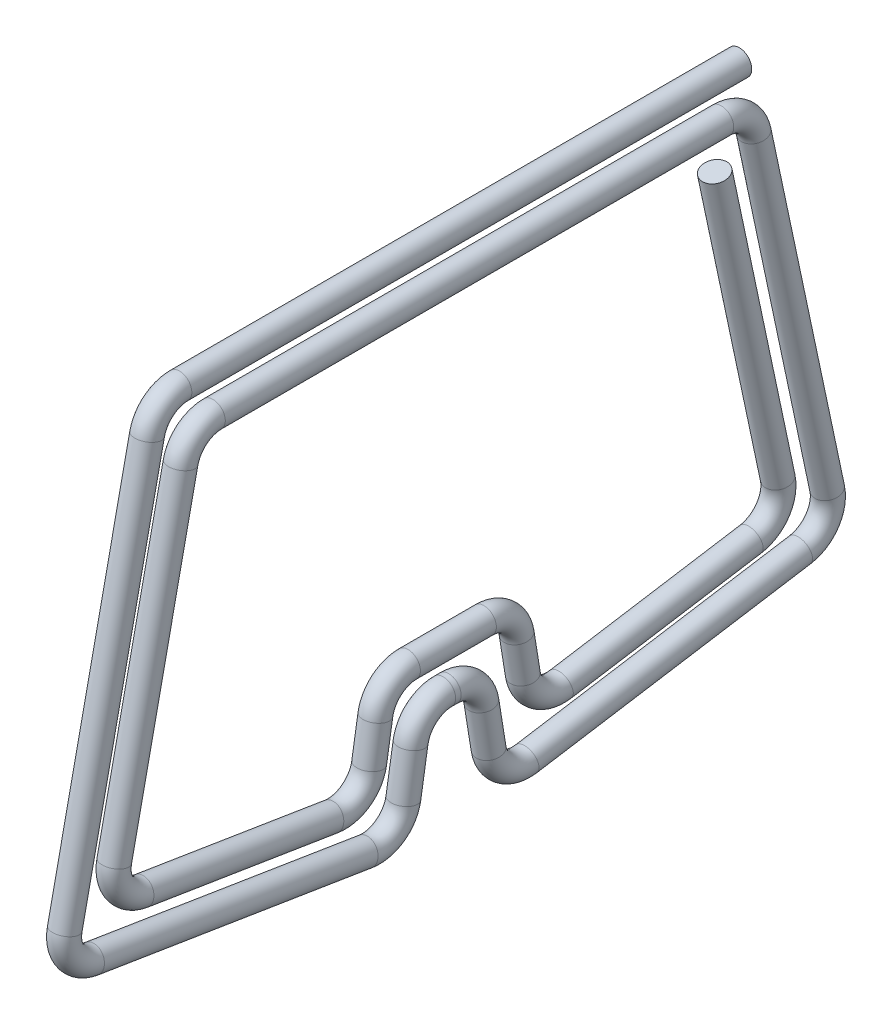
ISO-10303-21;
HEADER;
FILE_DESCRIPTION(('STEP AP214'),'2;1');
FILE_NAME('part.step','',(''),(''),'','','');
FILE_SCHEMA(('AUTOMOTIVE_DESIGN { 1 0 10303 214 1 1 1 1 }'));
ENDSEC;
DATA;
#1=APPLICATION_CONTEXT('core data for automotive mechanical design processes');
#2=APPLICATION_PROTOCOL_DEFINITION('international standard','automotive_design',2000,#1);
#3=PRODUCT_CONTEXT('',#1,'mechanical');
#4=PRODUCT('Part','Part','',(#3));
#5=PRODUCT_RELATED_PRODUCT_CATEGORY('part','',(#4));
#6=PRODUCT_DEFINITION_FORMATION('','',#4);
#7=PRODUCT_DEFINITION_CONTEXT('part definition',#1,'design');
#8=PRODUCT_DEFINITION('design','',#6,#7);
#9=PRODUCT_DEFINITION_SHAPE('','',#8);
#10=(LENGTH_UNIT() NAMED_UNIT(*) SI_UNIT(.MILLI.,.METRE.));
#11=(NAMED_UNIT(*) PLANE_ANGLE_UNIT() SI_UNIT($,.RADIAN.));
#12=(NAMED_UNIT(*) SI_UNIT($,.STERADIAN.) SOLID_ANGLE_UNIT());
#13=UNCERTAINTY_MEASURE_WITH_UNIT(LENGTH_MEASURE(1.E-05),#10,'distance_accuracy_value','');
#14=(GEOMETRIC_REPRESENTATION_CONTEXT(3) GLOBAL_UNCERTAINTY_ASSIGNED_CONTEXT((#13)) GLOBAL_UNIT_ASSIGNED_CONTEXT((#10,
#11,#12)) REPRESENTATION_CONTEXT('',''));
#15=CARTESIAN_POINT('',(0.,0.,0.));
#16=DIRECTION('',(0.,0.,1.));
#17=DIRECTION('',(1.,0.,0.));
#18=AXIS2_PLACEMENT_3D('',#15,#16,#17);
#19=CARTESIAN_POINT('',(0.,-40.8872377564679,-40.1258053985485));
#20=DIRECTION('',(0.,0.978147600733806,0.207911690817757));
#21=DIRECTION('',(0.,-0.207911690817757,0.978147600733806));
#22=AXIS2_PLACEMENT_3D('',#19,#20,#21);
#23=CYLINDRICAL_SURFACE('',#22,1.5);
#24=CARTESIAN_POINT('',(0.,-40.8872377564679,-40.1258053985485));
#25=DIRECTION('',(0.,-0.978147600733785,-0.207911690817856));
#26=DIRECTION('',(-1.,0.,0.));
#27=AXIS2_PLACEMENT_3D('',#24,#25,#26);
#28=CIRCLE('',#27,1.5);
#29=CARTESIAN_POINT('',(0.,-40.5753702202413,-41.5930267996492));
#30=VERTEX_POINT('',#29);
#31=EDGE_CURVE('E39',#30,#30,#28,.T.);
#32=ORIENTED_EDGE('',*,*,#31,.F.);
#33=EDGE_LOOP('',(#32));
#34=FACE_BOUND('',#33,.T.);
#35=CARTESIAN_POINT('',(0.,-5.00000000000002,-32.4977375331992));
#36=DIRECTION('',(0.,-0.978147600733785,-0.207911690817856));
#37=DIRECTION('',(-1.,0.,0.));
#38=AXIS2_PLACEMENT_3D('',#35,#36,#37);
#39=CIRCLE('',#38,1.5);
#40=CARTESIAN_POINT('',(-1.5,-5.00000000000002,-32.4977375331992));
#41=VERTEX_POINT('',#40);
#42=EDGE_CURVE('E10',#41,#41,#39,.T.);
#43=ORIENTED_EDGE('',*,*,#42,.T.);
#44=EDGE_LOOP('',(#43));
#45=FACE_BOUND('',#44,.T.);
#46=ADVANCED_FACE('F33',(#34,#45),#23,.T.);
#47=CARTESIAN_POINT('',(0.,-41.7188845197389,-36.2132149956133));
#48=DIRECTION('',(1.,0.,0.));
#49=DIRECTION('',(0.,0.,-1.));
#50=AXIS2_PLACEMENT_3D('',#47,#48,#49);
#51=TOROIDAL_SURFACE('',#50,3.99999999999996,1.5);
#52=CARTESIAN_POINT('',(0.,-45.6680705058202,-36.8487699085352));
#53=DIRECTION('',(0.,-0.158888728230554,0.987296496520309));
#54=DIRECTION('',(-1.,0.,0.));
#55=AXIS2_PLACEMENT_3D('',#52,#53,#54);
#56=CIRCLE('',#55,1.5);
#57=CARTESIAN_POINT('',(0.,-47.1490152506007,-37.0871030008808));
#58=VERTEX_POINT('',#57);
#59=EDGE_CURVE('E43',#58,#58,#56,.T.);
#60=CARTESIAN_POINT('',(0.,-41.7188845197389,-36.2132149956133));
#61=DIRECTION('',(1.,0.,0.));
#62=DIRECTION('',(0.,0.,-1.));
#63=AXIS2_PLACEMENT_3D('',#60,#61,#62);
#64=CIRCLE('',#63,5.49999999999996);
#65=EDGE_CURVE('',#58,#30,#64,.T.);
#66=ORIENTED_EDGE('',*,*,#59,.F.);
#67=ORIENTED_EDGE('',*,*,#31,.T.);
#68=ORIENTED_EDGE('',*,*,#65,.T.);
#69=ORIENTED_EDGE('',*,*,#65,.F.);
#70=EDGE_LOOP('',(#66,#68,#67,#69));
#71=FACE_BOUND('',#70,.T.);
#72=ADVANCED_FACE('F305',(#71),#51,.T.);
#73=CARTESIAN_POINT('',(0.,-49.3644450870781,-13.8803837017478));
#74=DIRECTION('',(0.,0.158888728230469,-0.987296496520323));
#75=DIRECTION('',(0.,0.987296496520323,0.158888728230469));
#76=AXIS2_PLACEMENT_3D('',#73,#74,#75);
#77=CYLINDRICAL_SURFACE('',#76,1.5);
#78=CARTESIAN_POINT('',(0.,-49.3644450870781,-13.8803837017478));
#79=DIRECTION('',(0.,-0.158888728230554,0.987296496520309));
#80=DIRECTION('',(-1.,0.,0.));
#81=AXIS2_PLACEMENT_3D('',#78,#79,#80);
#82=CIRCLE('',#81,1.5);
#83=CARTESIAN_POINT('',(0.,-50.8453898318586,-14.1187167940935));
#84=VERTEX_POINT('',#83);
#85=EDGE_CURVE('E47',#84,#84,#82,.T.);
#86=ORIENTED_EDGE('',*,*,#85,.F.);
#87=EDGE_LOOP('',(#86));
#88=FACE_BOUND('',#87,.T.);
#89=ORIENTED_EDGE('',*,*,#59,.T.);
#90=EDGE_LOOP('',(#89));
#91=FACE_BOUND('',#90,.T.);
#92=ADVANCED_FACE('F299',(#88,#91),#77,.T.);
#93=CARTESIAN_POINT('',(0.,-45.4152591009968,-13.244828788826));
#94=DIRECTION('',(1.,0.,0.));
#95=DIRECTION('',(0.,0.,-1.));
#96=AXIS2_PLACEMENT_3D('',#93,#94,#95);
#97=TOROIDAL_SURFACE('',#96,3.99999999999996,1.5);
#98=CARTESIAN_POINT('',(0.,-46.0508140139187,-9.29564280274469));
#99=DIRECTION('',(0.,0.987296496520311,0.158888728230541));
#100=DIRECTION('',(-1.,0.,0.));
#101=AXIS2_PLACEMENT_3D('',#98,#99,#100);
#102=CIRCLE('',#101,1.5);
#103=CARTESIAN_POINT('',(0.,-46.2891471062643,-7.8146980579642));
#104=VERTEX_POINT('',#103);
#105=EDGE_CURVE('E52',#104,#104,#102,.T.);
#106=CARTESIAN_POINT('',(0.,-45.4152591009968,-13.244828788826));
#107=DIRECTION('',(1.,0.,0.));
#108=DIRECTION('',(0.,0.,-1.));
#109=AXIS2_PLACEMENT_3D('',#106,#107,#108);
#110=CIRCLE('',#109,5.49999999999996);
#111=EDGE_CURVE('',#104,#84,#110,.T.);
#112=ORIENTED_EDGE('',*,*,#105,.F.);
#113=ORIENTED_EDGE('',*,*,#85,.T.);
#114=ORIENTED_EDGE('',*,*,#111,.T.);
#115=ORIENTED_EDGE('',*,*,#111,.F.);
#116=EDGE_LOOP('',(#112,#114,#113,#115));
#117=FACE_BOUND('',#116,.T.);
#118=ADVANCED_FACE('F293',(#117),#97,.T.);
#119=CARTESIAN_POINT('',(0.,-41.3644450870781,-8.54145072222094));
#120=DIRECTION('',(0.,-0.987296496520323,-0.158888728230468));
#121=DIRECTION('',(0.,0.158888728230468,-0.987296496520323));
#122=AXIS2_PLACEMENT_3D('',#119,#120,#121);
#123=CYLINDRICAL_SURFACE('',#122,1.5);
#124=CARTESIAN_POINT('',(0.,-41.3644450870781,-8.54145072222094));
#125=DIRECTION('',(0.,0.987296496520311,0.158888728230541));
#126=DIRECTION('',(-1.,0.,0.));
#127=AXIS2_PLACEMENT_3D('',#124,#125,#126);
#128=CIRCLE('',#127,1.5);
#129=CARTESIAN_POINT('',(0.,-41.1261119947324,-10.0223954670014));
#130=VERTEX_POINT('',#129);
#131=EDGE_CURVE('E55',#130,#130,#128,.T.);
#132=ORIENTED_EDGE('',*,*,#131,.F.);
#133=EDGE_LOOP('',(#132));
#134=FACE_BOUND('',#133,.T.);
#135=ORIENTED_EDGE('',*,*,#105,.T.);
#136=EDGE_LOOP('',(#135));
#137=FACE_BOUND('',#136,.T.);
#138=ADVANCED_FACE('F287',(#134,#137),#123,.T.);
#139=CARTESIAN_POINT('',(0.,-42.,-4.59226473613961));
#140=DIRECTION('',(-1.,0.,0.));
#141=DIRECTION('',(0.,0.,1.));
#142=AXIS2_PLACEMENT_3D('',#139,#140,#141);
#143=TOROIDAL_SURFACE('',#142,4.00000000000004,1.5);
#144=CARTESIAN_POINT('',(0.,-38.,-4.59226473613957));
#145=DIRECTION('',(0.,0.,1.));
#146=DIRECTION('',(-1.,0.,0.));
#147=AXIS2_PLACEMENT_3D('',#144,#145,#146);
#148=CIRCLE('',#147,1.5);
#149=CARTESIAN_POINT('',(0.,-36.5,-4.59226473613955));
#150=VERTEX_POINT('',#149);
#151=EDGE_CURVE('E58',#150,#150,#148,.T.);
#152=CARTESIAN_POINT('',(0.,-42.,-4.59226473613961));
#153=DIRECTION('',(-1.,0.,0.));
#154=DIRECTION('',(0.,0.,1.));
#155=AXIS2_PLACEMENT_3D('',#152,#153,#154);
#156=CIRCLE('',#155,5.50000000000004);
#157=EDGE_CURVE('',#150,#130,#156,.T.);
#158=ORIENTED_EDGE('',*,*,#151,.F.);
#159=ORIENTED_EDGE('',*,*,#131,.T.);
#160=ORIENTED_EDGE('',*,*,#157,.T.);
#161=ORIENTED_EDGE('',*,*,#157,.F.);
#162=EDGE_LOOP('',(#158,#160,#159,#161));
#163=FACE_BOUND('',#162,.T.);
#164=ADVANCED_FACE('F281',(#163),#143,.T.);
#165=CARTESIAN_POINT('',(0.,-38.,4.59226473613959));
#166=DIRECTION('',(0.,0.,-1.));
#167=DIRECTION('',(-1.,0.,0.));
#168=AXIS2_PLACEMENT_3D('',#165,#166,#167);
#169=CYLINDRICAL_SURFACE('',#168,1.5);
#170=CARTESIAN_POINT('',(0.,-38.,4.59226473613959));
#171=DIRECTION('',(0.,0.,1.));
#172=DIRECTION('',(-1.,0.,0.));
#173=AXIS2_PLACEMENT_3D('',#170,#171,#172);
#174=CIRCLE('',#173,1.5);
#175=CARTESIAN_POINT('',(0.,-36.5,4.59226473613959));
#176=VERTEX_POINT('',#175);
#177=EDGE_CURVE('E61',#176,#176,#174,.T.);
#178=ORIENTED_EDGE('',*,*,#177,.F.);
#179=EDGE_LOOP('',(#178));
#180=FACE_BOUND('',#179,.T.);
#181=ORIENTED_EDGE('',*,*,#151,.T.);
#182=EDGE_LOOP('',(#181));
#183=FACE_BOUND('',#182,.T.);
#184=ADVANCED_FACE('F275',(#180,#183),#169,.T.);
#185=CARTESIAN_POINT('',(0.,-42.,4.5922647361396));
#186=DIRECTION('',(-1.,0.,0.));
#187=DIRECTION('',(0.,0.,1.));
#188=AXIS2_PLACEMENT_3D('',#185,#186,#187);
#189=TOROIDAL_SURFACE('',#188,4.00000000000004,1.5);
#190=CARTESIAN_POINT('',(0.,-41.3644450870782,8.54145072222093));
#191=DIRECTION('',(0.,-0.987296496520339,0.15888872823037));
#192=DIRECTION('',(-1.,0.,0.));
#193=AXIS2_PLACEMENT_3D('',#190,#191,#192);
#194=CIRCLE('',#193,1.5);
#195=CARTESIAN_POINT('',(0.,-41.1261119947325,10.0223954670014));
#196=VERTEX_POINT('',#195);
#197=EDGE_CURVE('E64',#196,#196,#194,.T.);
#198=CARTESIAN_POINT('',(0.,-42.,4.5922647361396));
#199=DIRECTION('',(-1.,0.,0.));
#200=DIRECTION('',(0.,0.,1.));
#201=AXIS2_PLACEMENT_3D('',#198,#199,#200);
#202=CIRCLE('',#201,5.50000000000004);
#203=EDGE_CURVE('',#196,#176,#202,.T.);
#204=ORIENTED_EDGE('',*,*,#197,.F.);
#205=ORIENTED_EDGE('',*,*,#177,.T.);
#206=ORIENTED_EDGE('',*,*,#203,.T.);
#207=ORIENTED_EDGE('',*,*,#203,.F.);
#208=EDGE_LOOP('',(#204,#206,#205,#207));
#209=FACE_BOUND('',#208,.T.);
#210=ADVANCED_FACE('F269',(#209),#189,.T.);
#211=CARTESIAN_POINT('',(0.,-46.0508140139187,9.29564280274468));
#212=DIRECTION('',(0.,0.987296496520323,-0.158888728230467));
#213=DIRECTION('',(0.,0.158888728230467,0.987296496520323));
#214=AXIS2_PLACEMENT_3D('',#211,#212,#213);
#215=CYLINDRICAL_SURFACE('',#214,1.5);
#216=CARTESIAN_POINT('',(0.,-46.0508140139187,9.29564280274468));
#217=DIRECTION('',(0.,-0.987296496520339,0.15888872823037));
#218=DIRECTION('',(-1.,0.,0.));
#219=AXIS2_PLACEMENT_3D('',#216,#217,#218);
#220=CIRCLE('',#219,1.5);
#221=CARTESIAN_POINT('',(0.,-46.2891471062644,7.81469805796419));
#222=VERTEX_POINT('',#221);
#223=EDGE_CURVE('E67',#222,#222,#220,.T.);
#224=ORIENTED_EDGE('',*,*,#223,.F.);
#225=EDGE_LOOP('',(#224));
#226=FACE_BOUND('',#225,.T.);
#227=ORIENTED_EDGE('',*,*,#197,.T.);
#228=EDGE_LOOP('',(#227));
#229=FACE_BOUND('',#228,.T.);
#230=ADVANCED_FACE('F263',(#226,#229),#215,.T.);
#231=CARTESIAN_POINT('',(0.,-45.4152591009968,13.2448287888259));
#232=DIRECTION('',(1.,0.,0.));
#233=DIRECTION('',(0.,0.,-1.));
#234=AXIS2_PLACEMENT_3D('',#231,#232,#233);
#235=TOROIDAL_SURFACE('',#234,3.99999999999997,1.5);
#236=CARTESIAN_POINT('',(0.,-49.3644450870781,13.8803837017479));
#237=DIRECTION('',(0.,0.158888728230384,0.987296496520336));
#238=DIRECTION('',(-1.,0.,0.));
#239=AXIS2_PLACEMENT_3D('',#236,#237,#238);
#240=CIRCLE('',#239,1.5);
#241=CARTESIAN_POINT('',(0.,-50.8453898318586,14.1187167940936));
#242=VERTEX_POINT('',#241);
#243=EDGE_CURVE('E70',#242,#242,#240,.T.);
#244=CARTESIAN_POINT('',(0.,-45.4152591009968,13.2448287888259));
#245=DIRECTION('',(1.,0.,0.));
#246=DIRECTION('',(0.,0.,-1.));
#247=AXIS2_PLACEMENT_3D('',#244,#245,#246);
#248=CIRCLE('',#247,5.49999999999997);
#249=EDGE_CURVE('',#242,#222,#248,.T.);
#250=ORIENTED_EDGE('',*,*,#243,.F.);
#251=ORIENTED_EDGE('',*,*,#223,.T.);
#252=ORIENTED_EDGE('',*,*,#249,.T.);
#253=ORIENTED_EDGE('',*,*,#249,.F.);
#254=EDGE_LOOP('',(#250,#252,#251,#253));
#255=FACE_BOUND('',#254,.T.);
#256=ADVANCED_FACE('F257',(#255),#235,.T.);
#257=CARTESIAN_POINT('',(0.,-45.6680705058202,36.8487699085352));
#258=DIRECTION('',(0.,-0.158888728230468,-0.987296496520323));
#259=DIRECTION('',(0.,0.987296496520323,-0.158888728230468));
#260=AXIS2_PLACEMENT_3D('',#257,#258,#259);
#261=CYLINDRICAL_SURFACE('',#260,1.5);
#262=CARTESIAN_POINT('',(0.,-45.6680705058202,36.8487699085352));
#263=DIRECTION('',(0.,0.158888728230384,0.987296496520336));
#264=DIRECTION('',(-1.,0.,0.));
#265=AXIS2_PLACEMENT_3D('',#262,#263,#264);
#266=CIRCLE('',#265,1.5);
#267=CARTESIAN_POINT('',(0.,-47.1490152506007,37.0871030008809));
#268=VERTEX_POINT('',#267);
#269=EDGE_CURVE('E73',#268,#268,#266,.T.);
#270=ORIENTED_EDGE('',*,*,#269,.F.);
#271=EDGE_LOOP('',(#270));
#272=FACE_BOUND('',#271,.T.);
#273=ORIENTED_EDGE('',*,*,#243,.T.);
#274=EDGE_LOOP('',(#273));
#275=FACE_BOUND('',#274,.T.);
#276=ADVANCED_FACE('F251',(#272,#275),#261,.T.);
#277=CARTESIAN_POINT('',(0.,-41.718884519739,36.2132149956133));
#278=DIRECTION('',(1.,0.,0.));
#279=DIRECTION('',(0.,0.,-1.));
#280=AXIS2_PLACEMENT_3D('',#277,#278,#279);
#281=TOROIDAL_SURFACE('',#280,3.99999999999997,1.5);
#282=CARTESIAN_POINT('',(0.,-40.8872377564679,40.1258053985485));
#283=DIRECTION('',(0.,0.978147600733821,-0.207911690817688));
#284=DIRECTION('',(-1.,0.,0.));
#285=AXIS2_PLACEMENT_3D('',#282,#283,#284);
#286=CIRCLE('',#285,1.5);
#287=CARTESIAN_POINT('',(0.,-40.5753702202412,41.5930267996492));
#288=VERTEX_POINT('',#287);
#289=EDGE_CURVE('E76',#288,#288,#286,.T.);
#290=CARTESIAN_POINT('',(0.,-41.718884519739,36.2132149956133));
#291=DIRECTION('',(1.,0.,0.));
#292=DIRECTION('',(0.,0.,-1.));
#293=AXIS2_PLACEMENT_3D('',#290,#291,#292);
#294=CIRCLE('',#293,5.49999999999997);
#295=EDGE_CURVE('',#288,#268,#294,.T.);
#296=ORIENTED_EDGE('',*,*,#289,.F.);
#297=ORIENTED_EDGE('',*,*,#269,.T.);
#298=ORIENTED_EDGE('',*,*,#295,.T.);
#299=ORIENTED_EDGE('',*,*,#295,.F.);
#300=EDGE_LOOP('',(#296,#298,#297,#299));
#301=FACE_BOUND('',#300,.T.);
#302=ADVANCED_FACE('F245',(#301),#281,.T.);
#303=CARTESIAN_POINT('',(0.,-3.16835323672899,32.1084089950043));
#304=DIRECTION('',(0.,-0.978147600733806,0.207911690817756));
#305=DIRECTION('',(0.,-0.207911690817756,-0.978147600733806));
#306=AXIS2_PLACEMENT_3D('',#303,#304,#305);
#307=CYLINDRICAL_SURFACE('',#306,1.5);
#308=CARTESIAN_POINT('',(0.,-3.16835323672899,32.1084089950043));
#309=DIRECTION('',(0.,0.978147600733821,-0.207911690817688));
#310=DIRECTION('',(-1.,0.,0.));
#311=AXIS2_PLACEMENT_3D('',#308,#309,#310);
#312=CIRCLE('',#311,1.5);
#313=CARTESIAN_POINT('',(0.,-2.85648570050236,33.575630396105));
#314=VERTEX_POINT('',#313);
#315=EDGE_CURVE('E79',#314,#314,#312,.T.);
#316=ORIENTED_EDGE('',*,*,#315,.F.);
#317=EDGE_LOOP('',(#316));
#318=FACE_BOUND('',#317,.T.);
#319=ORIENTED_EDGE('',*,*,#289,.T.);
#320=EDGE_LOOP('',(#319));
#321=FACE_BOUND('',#320,.T.);
#322=ADVANCED_FACE('F239',(#318,#321),#307,.T.);
#323=CARTESIAN_POINT('',(0.,-4.00000000000001,28.1958185920691));
#324=DIRECTION('',(1.,0.,0.));
#325=DIRECTION('',(0.,0.,-1.));
#326=AXIS2_PLACEMENT_3D('',#323,#324,#325);
#327=TOROIDAL_SURFACE('',#326,3.99999999999998,1.5);
#328=CARTESIAN_POINT('',(0.,0.,28.1958185920691));
#329=DIRECTION('',(0.,0.,-1.));
#330=DIRECTION('',(-1.,0.,0.));
#331=AXIS2_PLACEMENT_3D('',#328,#329,#330);
#332=CIRCLE('',#331,1.5);
#333=CARTESIAN_POINT('',(0.,1.49999999999997,28.1958185920691));
#334=VERTEX_POINT('',#333);
#335=EDGE_CURVE('E82',#334,#334,#332,.T.);
#336=CARTESIAN_POINT('',(0.,-4.00000000000001,28.1958185920691));
#337=DIRECTION('',(1.,0.,0.));
#338=DIRECTION('',(0.,0.,-1.));
#339=AXIS2_PLACEMENT_3D('',#336,#337,#338);
#340=CIRCLE('',#339,5.49999999999998);
#341=EDGE_CURVE('',#334,#314,#340,.T.);
#342=ORIENTED_EDGE('',*,*,#335,.F.);
#343=ORIENTED_EDGE('',*,*,#315,.T.);
#344=ORIENTED_EDGE('',*,*,#341,.T.);
#345=ORIENTED_EDGE('',*,*,#341,.F.);
#346=EDGE_LOOP('',(#342,#344,#343,#345));
#347=FACE_BOUND('',#346,.T.);
#348=ADVANCED_FACE('F233',(#347),#327,.T.);
#349=CARTESIAN_POINT('',(0.,0.,-33.3075215663943));
#350=DIRECTION('',(0.,0.,1.));
#351=DIRECTION('',(0.,-1.,0.));
#352=AXIS2_PLACEMENT_3D('',#349,#350,#351);
#353=CYLINDRICAL_SURFACE('',#352,1.5);
#354=CARTESIAN_POINT('',(0.,0.,-33.3075215663943));
#355=DIRECTION('',(0.,0.,-1.));
#356=DIRECTION('',(-1.,0.,0.));
#357=AXIS2_PLACEMENT_3D('',#354,#355,#356);
#358=CIRCLE('',#357,1.5);
#359=CARTESIAN_POINT('',(0.,1.49999999999998,-33.3075215663943));
#360=VERTEX_POINT('',#359);
#361=EDGE_CURVE('E85',#360,#360,#358,.T.);
#362=ORIENTED_EDGE('',*,*,#361,.F.);
#363=EDGE_LOOP('',(#362));
#364=FACE_BOUND('',#363,.T.);
#365=ORIENTED_EDGE('',*,*,#335,.T.);
#366=EDGE_LOOP('',(#365));
#367=FACE_BOUND('',#366,.T.);
#368=ADVANCED_FACE('F227',(#364,#367),#353,.T.);
#369=CARTESIAN_POINT('',(0.,-4.,-33.3075215663943));
#370=DIRECTION('',(1.,0.,0.));
#371=DIRECTION('',(0.,0.,-1.));
#372=AXIS2_PLACEMENT_3D('',#369,#370,#371);
#373=TOROIDAL_SURFACE('',#372,3.99999999999998,1.5);
#374=CARTESIAN_POINT('',(0.,-3.16835323672902,-37.2201119693295));
#375=DIRECTION('',(0.,-0.978147600733796,-0.207911690817803));
#376=DIRECTION('',(-1.,0.,0.));
#377=AXIS2_PLACEMENT_3D('',#374,#375,#376);
#378=CIRCLE('',#377,1.5);
#379=CARTESIAN_POINT('',(0.,-2.8564857005024,-38.6873333704302));
#380=VERTEX_POINT('',#379);
#381=EDGE_CURVE('E88',#380,#380,#378,.T.);
#382=CARTESIAN_POINT('',(0.,-4.,-33.3075215663943));
#383=DIRECTION('',(1.,0.,0.));
#384=DIRECTION('',(0.,0.,-1.));
#385=AXIS2_PLACEMENT_3D('',#382,#383,#384);
#386=CIRCLE('',#385,5.49999999999998);
#387=EDGE_CURVE('',#380,#360,#386,.T.);
#388=ORIENTED_EDGE('',*,*,#381,.F.);
#389=ORIENTED_EDGE('',*,*,#361,.T.);
#390=ORIENTED_EDGE('',*,*,#387,.T.);
#391=ORIENTED_EDGE('',*,*,#387,.F.);
#392=EDGE_LOOP('',(#388,#390,#389,#391));
#393=FACE_BOUND('',#392,.T.);
#394=ADVANCED_FACE('F221',(#393),#373,.T.);
#395=CARTESIAN_POINT('',(0.,-44.9886321067942,-46.1092866540319));
#396=DIRECTION('',(0.,0.978147600733806,0.207911690817756));
#397=DIRECTION('',(0.,-0.207911690817757,0.978147600733806));
#398=AXIS2_PLACEMENT_3D('',#395,#396,#397);
#399=CYLINDRICAL_SURFACE('',#398,1.5);
#400=CARTESIAN_POINT('',(0.,-44.9886321067942,-46.1092866540319));
#401=DIRECTION('',(0.,-0.978147600733796,-0.207911690817803));
#402=DIRECTION('',(-1.,0.,0.));
#403=AXIS2_PLACEMENT_3D('',#400,#401,#402);
#404=CIRCLE('',#403,1.5);
#405=CARTESIAN_POINT('',(0.,-44.6767645705676,-47.5765080551326));
#406=VERTEX_POINT('',#405);
#407=EDGE_CURVE('E91',#406,#406,#404,.T.);
#408=ORIENTED_EDGE('',*,*,#407,.F.);
#409=EDGE_LOOP('',(#408));
#410=FACE_BOUND('',#409,.T.);
#411=ORIENTED_EDGE('',*,*,#381,.T.);
#412=EDGE_LOOP('',(#411));
#413=FACE_BOUND('',#412,.T.);
#414=ADVANCED_FACE('F215',(#410,#413),#399,.T.);
#415=CARTESIAN_POINT('',(0.,-45.8202788700653,-42.1966962510967));
#416=DIRECTION('',(1.,0.,0.));
#417=DIRECTION('',(0.,0.,-1.));
#418=AXIS2_PLACEMENT_3D('',#415,#416,#417);
#419=TOROIDAL_SURFACE('',#418,3.99999999999998,1.5);
#420=CARTESIAN_POINT('',(0.,-49.7694648561465,-42.8322511640185));
#421=DIRECTION('',(0.,-0.158888728230501,0.987296496520318));
#422=DIRECTION('',(-1.,0.,0.));
#423=AXIS2_PLACEMENT_3D('',#420,#421,#422);
#424=CIRCLE('',#423,1.5);
#425=CARTESIAN_POINT('',(0.,-51.250409600927,-43.0705842563642));
#426=VERTEX_POINT('',#425);
#427=EDGE_CURVE('E94',#426,#426,#424,.T.);
#428=CARTESIAN_POINT('',(0.,-45.8202788700653,-42.1966962510967));
#429=DIRECTION('',(1.,0.,0.));
#430=DIRECTION('',(0.,0.,-1.));
#431=AXIS2_PLACEMENT_3D('',#428,#429,#430);
#432=CIRCLE('',#431,5.49999999999998);
#433=EDGE_CURVE('',#426,#406,#432,.T.);
#434=ORIENTED_EDGE('',*,*,#427,.F.);
#435=ORIENTED_EDGE('',*,*,#407,.T.);
#436=ORIENTED_EDGE('',*,*,#433,.T.);
#437=ORIENTED_EDGE('',*,*,#433,.F.);
#438=EDGE_LOOP('',(#434,#436,#435,#437));
#439=FACE_BOUND('',#438,.T.);
#440=ADVANCED_FACE('F209',(#439),#419,.T.);
#441=CARTESIAN_POINT('',(0.,-55.0953712108321,-9.73834486029859));
#442=DIRECTION('',(0.,0.158888728230468,-0.987296496520323));
#443=DIRECTION('',(0.,0.987296496520323,0.158888728230468));
#444=AXIS2_PLACEMENT_3D('',#441,#442,#443);
#445=CYLINDRICAL_SURFACE('',#444,1.5);
#446=CARTESIAN_POINT('',(0.,-55.0953712108321,-9.73834486029859));
#447=DIRECTION('',(0.,-0.158888728230501,0.987296496520318));
#448=DIRECTION('',(-1.,0.,0.));
#449=AXIS2_PLACEMENT_3D('',#446,#447,#448);
#450=CIRCLE('',#449,1.5);
#451=CARTESIAN_POINT('',(0.,-56.5763159556125,-9.97667795264429));
#452=VERTEX_POINT('',#451);
#453=EDGE_CURVE('E97',#452,#452,#450,.T.);
#454=ORIENTED_EDGE('',*,*,#453,.F.);
#455=EDGE_LOOP('',(#454));
#456=FACE_BOUND('',#455,.T.);
#457=ORIENTED_EDGE('',*,*,#427,.T.);
#458=EDGE_LOOP('',(#457));
#459=FACE_BOUND('',#458,.T.);
#460=ADVANCED_FACE('F203',(#456,#459),#445,.T.);
#461=CARTESIAN_POINT('',(0.,-51.1461852247508,-9.10278994737669));
#462=DIRECTION('',(1.,0.,0.));
#463=DIRECTION('',(0.,0.,-1.));
#464=AXIS2_PLACEMENT_3D('',#461,#462,#463);
#465=TOROIDAL_SURFACE('',#464,3.99999999999998,1.5);
#466=CARTESIAN_POINT('',(0.,-51.7817401376726,-5.15360396129542));
#467=DIRECTION('',(0.,0.98729649652032,0.158888728230487));
#468=DIRECTION('',(-1.,0.,0.));
#469=AXIS2_PLACEMENT_3D('',#466,#467,#468);
#470=CIRCLE('',#469,1.5);
#471=CARTESIAN_POINT('',(0.,-52.0200732300183,-3.67265921651493));
#472=VERTEX_POINT('',#471);
#473=EDGE_CURVE('E100',#472,#472,#470,.T.);
#474=CARTESIAN_POINT('',(0.,-51.1461852247508,-9.10278994737669));
#475=DIRECTION('',(1.,0.,0.));
#476=DIRECTION('',(0.,0.,-1.));
#477=AXIS2_PLACEMENT_3D('',#474,#475,#476);
#478=CIRCLE('',#477,5.49999999999998);
#479=EDGE_CURVE('',#472,#452,#478,.T.);
#480=ORIENTED_EDGE('',*,*,#473,.F.);
#481=ORIENTED_EDGE('',*,*,#453,.T.);
#482=ORIENTED_EDGE('',*,*,#479,.T.);
#483=ORIENTED_EDGE('',*,*,#479,.F.);
#484=EDGE_LOOP('',(#480,#482,#481,#483));
#485=FACE_BOUND('',#484,.T.);
#486=ADVANCED_FACE('F197',(#485),#465,.T.);
#487=CARTESIAN_POINT('',(0.,-46.3644450870781,-4.28178164239544));
#488=DIRECTION('',(0.,-0.987296496520323,-0.158888728230468));
#489=DIRECTION('',(0.,0.158888728230468,-0.987296496520323));
#490=AXIS2_PLACEMENT_3D('',#487,#488,#489);
#491=CYLINDRICAL_SURFACE('',#490,1.5);
#492=CARTESIAN_POINT('',(0.,-46.3644450870781,-4.28178164239544));
#493=DIRECTION('',(0.,0.98729649652032,0.158888728230487));
#494=DIRECTION('',(-1.,0.,0.));
#495=AXIS2_PLACEMENT_3D('',#492,#493,#494);
#496=CIRCLE('',#495,1.5);
#497=CARTESIAN_POINT('',(0.,-46.1261119947324,-5.76272638717592));
#498=VERTEX_POINT('',#497);
#499=EDGE_CURVE('E103',#498,#498,#496,.T.);
#500=ORIENTED_EDGE('',*,*,#499,.F.);
#501=EDGE_LOOP('',(#500));
#502=FACE_BOUND('',#501,.T.);
#503=ORIENTED_EDGE('',*,*,#473,.T.);
#504=EDGE_LOOP('',(#503));
#505=FACE_BOUND('',#504,.T.);
#506=ADVANCED_FACE('F191',(#502,#505),#491,.T.);
#507=CARTESIAN_POINT('',(0.,-47.,-0.332595656314122));
#508=DIRECTION('',(-1.,0.,0.));
#509=DIRECTION('',(0.,0.,1.));
#510=AXIS2_PLACEMENT_3D('',#507,#508,#509);
#511=TOROIDAL_SURFACE('',#510,4.00000000000002,1.5);
#512=CARTESIAN_POINT('',(0.,-43.,-0.332595656314101));
#513=DIRECTION('',(0.,0.,1.));
#514=DIRECTION('',(-1.,0.,0.));
#515=AXIS2_PLACEMENT_3D('',#512,#513,#514);
#516=CIRCLE('',#515,1.5);
#517=CARTESIAN_POINT('',(0.,-41.5,-0.332595656314093));
#518=VERTEX_POINT('',#517);
#519=EDGE_CURVE('E106',#518,#518,#516,.T.);
#520=CARTESIAN_POINT('',(0.,-47.,-0.332595656314122));
#521=DIRECTION('',(-1.,0.,0.));
#522=DIRECTION('',(0.,0.,1.));
#523=AXIS2_PLACEMENT_3D('',#520,#521,#522);
#524=CIRCLE('',#523,5.50000000000002);
#525=EDGE_CURVE('',#518,#498,#524,.T.);
#526=ORIENTED_EDGE('',*,*,#519,.F.);
#527=ORIENTED_EDGE('',*,*,#499,.T.);
#528=ORIENTED_EDGE('',*,*,#525,.T.);
#529=ORIENTED_EDGE('',*,*,#525,.F.);
#530=EDGE_LOOP('',(#526,#528,#527,#529));
#531=FACE_BOUND('',#530,.T.);
#532=ADVANCED_FACE('F185',(#531),#511,.T.);
#533=CARTESIAN_POINT('',(0.,-43.,0.332595656314071));
#534=DIRECTION('',(0.,0.,-1.));
#535=DIRECTION('',(-1.,0.,0.));
#536=AXIS2_PLACEMENT_3D('',#533,#534,#535);
#537=CYLINDRICAL_SURFACE('',#536,1.5);
#538=CARTESIAN_POINT('',(0.,-43.,0.332595656314071));
#539=DIRECTION('',(0.,0.,1.));
#540=DIRECTION('',(-1.,0.,0.));
#541=AXIS2_PLACEMENT_3D('',#538,#539,#540);
#542=CIRCLE('',#541,1.5);
#543=CARTESIAN_POINT('',(0.,-41.5,0.33259565631406));
#544=VERTEX_POINT('',#543);
#545=EDGE_CURVE('E109',#544,#544,#542,.T.);
#546=ORIENTED_EDGE('',*,*,#545,.F.);
#547=EDGE_LOOP('',(#546));
#548=FACE_BOUND('',#547,.T.);
#549=ORIENTED_EDGE('',*,*,#519,.T.);
#550=EDGE_LOOP('',(#549));
#551=FACE_BOUND('',#550,.T.);
#552=ADVANCED_FACE('F179',(#548,#551),#537,.T.);
#553=CARTESIAN_POINT('',(0.,-47.,0.332595656314098));
#554=DIRECTION('',(-1.,0.,0.));
#555=DIRECTION('',(0.,0.,1.));
#556=AXIS2_PLACEMENT_3D('',#553,#554,#555);
#557=TOROIDAL_SURFACE('',#556,4.00000000000001,1.5);
#558=CARTESIAN_POINT('',(0.,-46.3644450870781,4.28178164239541));
#559=DIRECTION('',(0.,-0.98729649652033,0.158888728230428));
#560=DIRECTION('',(-1.,0.,0.));
#561=AXIS2_PLACEMENT_3D('',#558,#559,#560);
#562=CIRCLE('',#561,1.5);
#563=CARTESIAN_POINT('',(0.,-46.1261119947325,5.76272638717589));
#564=VERTEX_POINT('',#563);
#565=EDGE_CURVE('E112',#564,#564,#562,.T.);
#566=CARTESIAN_POINT('',(0.,-47.,0.332595656314098));
#567=DIRECTION('',(-1.,0.,0.));
#568=DIRECTION('',(0.,0.,1.));
#569=AXIS2_PLACEMENT_3D('',#566,#567,#568);
#570=CIRCLE('',#569,5.50000000000001);
#571=EDGE_CURVE('',#564,#544,#570,.T.);
#572=ORIENTED_EDGE('',*,*,#565,.F.);
#573=ORIENTED_EDGE('',*,*,#545,.T.);
#574=ORIENTED_EDGE('',*,*,#571,.T.);
#575=ORIENTED_EDGE('',*,*,#571,.F.);
#576=EDGE_LOOP('',(#572,#574,#573,#575));
#577=FACE_BOUND('',#576,.T.);
#578=ADVANCED_FACE('F173',(#577),#557,.T.);
#579=CARTESIAN_POINT('',(0.,-51.7817401376726,5.15360396129538));
#580=DIRECTION('',(0.,0.987296496520323,-0.158888728230469));
#581=DIRECTION('',(0.,0.158888728230469,0.987296496520323));
#582=AXIS2_PLACEMENT_3D('',#579,#580,#581);
#583=CYLINDRICAL_SURFACE('',#582,1.5);
#584=CARTESIAN_POINT('',(0.,-51.7817401376726,5.15360396129538));
#585=DIRECTION('',(0.,-0.98729649652033,0.158888728230428));
#586=DIRECTION('',(-1.,0.,0.));
#587=AXIS2_PLACEMENT_3D('',#584,#585,#586);
#588=CIRCLE('',#587,1.5);
#589=CARTESIAN_POINT('',(0.,-52.0200732300183,3.67265921651489));
#590=VERTEX_POINT('',#589);
#591=EDGE_CURVE('E115',#590,#590,#588,.T.);
#592=ORIENTED_EDGE('',*,*,#591,.F.);
#593=EDGE_LOOP('',(#592));
#594=FACE_BOUND('',#593,.T.);
#595=ORIENTED_EDGE('',*,*,#565,.T.);
#596=EDGE_LOOP('',(#595));
#597=FACE_BOUND('',#596,.T.);
#598=ADVANCED_FACE('F167',(#594,#597),#583,.T.);
#599=CARTESIAN_POINT('',(0.,-51.1461852247508,9.10278994737667));
#600=DIRECTION('',(1.,0.,0.));
#601=DIRECTION('',(0.,0.,-1.));
#602=AXIS2_PLACEMENT_3D('',#599,#600,#601);
#603=TOROIDAL_SURFACE('',#602,3.99999999999999,1.5);
#604=CARTESIAN_POINT('',(0.,-55.0953712108321,9.73834486029857));
#605=DIRECTION('',(0.,0.158888728230442,0.987296496520327));
#606=DIRECTION('',(-1.,0.,0.));
#607=AXIS2_PLACEMENT_3D('',#604,#605,#606);
#608=CIRCLE('',#607,1.5);
#609=CARTESIAN_POINT('',(0.,-56.5763159556126,9.97667795264429));
#610=VERTEX_POINT('',#609);
#611=EDGE_CURVE('E118',#610,#610,#608,.T.);
#612=CARTESIAN_POINT('',(0.,-51.1461852247508,9.10278994737667));
#613=DIRECTION('',(1.,0.,0.));
#614=DIRECTION('',(0.,0.,-1.));
#615=AXIS2_PLACEMENT_3D('',#612,#613,#614);
#616=CIRCLE('',#615,5.49999999999999);
#617=EDGE_CURVE('',#610,#590,#616,.T.);
#618=ORIENTED_EDGE('',*,*,#611,.F.);
#619=ORIENTED_EDGE('',*,*,#591,.T.);
#620=ORIENTED_EDGE('',*,*,#617,.T.);
#621=ORIENTED_EDGE('',*,*,#617,.F.);
#622=EDGE_LOOP('',(#618,#620,#619,#621));
#623=FACE_BOUND('',#622,.T.);
#624=ADVANCED_FACE('F161',(#623),#603,.T.);
#625=CARTESIAN_POINT('',(0.,-49.7694648561466,42.8322511640185));
#626=DIRECTION('',(0.,-0.158888728230468,-0.987296496520323));
#627=DIRECTION('',(0.,0.987296496520323,-0.158888728230468));
#628=AXIS2_PLACEMENT_3D('',#625,#626,#627);
#629=CYLINDRICAL_SURFACE('',#628,1.5);
#630=CARTESIAN_POINT('',(0.,-49.7694648561466,42.8322511640185));
#631=DIRECTION('',(0.,0.158888728230442,0.987296496520327));
#632=DIRECTION('',(-1.,0.,0.));
#633=AXIS2_PLACEMENT_3D('',#630,#631,#632);
#634=CIRCLE('',#633,1.5);
#635=CARTESIAN_POINT('',(0.,-51.250409600927,43.0705842563642));
#636=VERTEX_POINT('',#635);
#637=EDGE_CURVE('E121',#636,#636,#634,.T.);
#638=ORIENTED_EDGE('',*,*,#637,.F.);
#639=EDGE_LOOP('',(#638));
#640=FACE_BOUND('',#639,.T.);
#641=ORIENTED_EDGE('',*,*,#611,.T.);
#642=EDGE_LOOP('',(#641));
#643=FACE_BOUND('',#642,.T.);
#644=ADVANCED_FACE('F155',(#640,#643),#629,.T.);
#645=CARTESIAN_POINT('',(0.,-45.8202788700653,42.1966962510967));
#646=DIRECTION('',(1.,0.,0.));
#647=DIRECTION('',(0.,0.,-1.));
#648=AXIS2_PLACEMENT_3D('',#645,#646,#647);
#649=TOROIDAL_SURFACE('',#648,3.99999999999999,1.5);
#650=CARTESIAN_POINT('',(0.,-44.9886321067942,46.1092866540319));
#651=DIRECTION('',(0.,0.978147600733809,-0.207911690817745));
#652=DIRECTION('',(-1.,0.,0.));
#653=AXIS2_PLACEMENT_3D('',#650,#651,#652);
#654=CIRCLE('',#653,1.5);
#655=CARTESIAN_POINT('',(0.,-44.6767645705676,47.5765080551326));
#656=VERTEX_POINT('',#655);
#657=EDGE_CURVE('E124',#656,#656,#654,.T.);
#658=CARTESIAN_POINT('',(0.,-45.8202788700653,42.1966962510967));
#659=DIRECTION('',(1.,0.,0.));
#660=DIRECTION('',(0.,0.,-1.));
#661=AXIS2_PLACEMENT_3D('',#658,#659,#660);
#662=CIRCLE('',#661,5.5);
#663=EDGE_CURVE('',#656,#636,#662,.T.);
#664=ORIENTED_EDGE('',*,*,#657,.F.);
#665=ORIENTED_EDGE('',*,*,#637,.T.);
#666=ORIENTED_EDGE('',*,*,#663,.T.);
#667=ORIENTED_EDGE('',*,*,#663,.F.);
#668=EDGE_LOOP('',(#664,#666,#665,#667));
#669=FACE_BOUND('',#668,.T.);
#670=ADVANCED_FACE('F149',(#669),#649,.T.);
#671=CARTESIAN_POINT('',(0.,1.831646763271,36.1573291609794));
#672=DIRECTION('',(0.,-0.978147600733806,0.207911690817756));
#673=DIRECTION('',(0.,-0.207911690817756,-0.978147600733806));
#674=AXIS2_PLACEMENT_3D('',#671,#672,#673);
#675=CYLINDRICAL_SURFACE('',#674,1.5);
#676=CARTESIAN_POINT('',(0.,1.831646763271,36.1573291609794));
#677=DIRECTION('',(0.,0.978147600733809,-0.207911690817745));
#678=DIRECTION('',(-1.,0.,0.));
#679=AXIS2_PLACEMENT_3D('',#676,#677,#678);
#680=CIRCLE('',#679,1.5);
#681=CARTESIAN_POINT('',(0.,2.14351429949763,37.6245505620801));
#682=VERTEX_POINT('',#681);
#683=EDGE_CURVE('E127',#682,#682,#680,.T.);
#684=ORIENTED_EDGE('',*,*,#683,.F.);
#685=EDGE_LOOP('',(#684));
#686=FACE_BOUND('',#685,.T.);
#687=ORIENTED_EDGE('',*,*,#657,.T.);
#688=EDGE_LOOP('',(#687));
#689=FACE_BOUND('',#688,.T.);
#690=ADVANCED_FACE('F143',(#686,#689),#675,.T.);
#691=CARTESIAN_POINT('',(0.,1.,32.2447387580442));
#692=DIRECTION('',(1.,0.,0.));
#693=DIRECTION('',(0.,0.,-1.));
#694=AXIS2_PLACEMENT_3D('',#691,#692,#693);
#695=TOROIDAL_SURFACE('',#694,4.,1.5);
#696=CARTESIAN_POINT('',(0.,5.,32.2447387580441));
#697=DIRECTION('',(0.,0.,-1.));
#698=DIRECTION('',(-1.,0.,0.));
#699=AXIS2_PLACEMENT_3D('',#696,#697,#698);
#700=CIRCLE('',#699,1.5);
#701=CARTESIAN_POINT('',(0.,6.5,32.2447387580441));
#702=VERTEX_POINT('',#701);
#703=EDGE_CURVE('E130',#702,#702,#700,.T.);
#704=CARTESIAN_POINT('',(0.,1.,32.2447387580442));
#705=DIRECTION('',(1.,0.,0.));
#706=DIRECTION('',(0.,0.,-1.));
#707=AXIS2_PLACEMENT_3D('',#704,#705,#706);
#708=CIRCLE('',#707,5.5);
#709=EDGE_CURVE('',#702,#682,#708,.T.);
#710=ORIENTED_EDGE('',*,*,#703,.F.);
#711=ORIENTED_EDGE('',*,*,#683,.T.);
#712=ORIENTED_EDGE('',*,*,#709,.T.);
#713=ORIENTED_EDGE('',*,*,#709,.F.);
#714=EDGE_LOOP('',(#710,#712,#711,#713));
#715=FACE_BOUND('',#714,.T.);
#716=ADVANCED_FACE('F140',(#715),#695,.T.);
#717=CARTESIAN_POINT('',(0.,5.,32.2447387580441));
#718=DIRECTION('',(0.,0.,-1.));
#719=DIRECTION('',(-1.,0.,0.));
#720=AXIS2_PLACEMENT_3D('',#717,#718,#719);
#721=CYLINDRICAL_SURFACE('',#720,1.5);
#722=ORIENTED_EDGE('',*,*,#703,.T.);
#723=EDGE_LOOP('',(#722));
#724=FACE_BOUND('',#723,.T.);
#725=CARTESIAN_POINT('',(0.,5.,-35.4838748908242));
#726=DIRECTION('',(0.,0.,-1.));
#727=DIRECTION('',(-1.,0.,0.));
#728=AXIS2_PLACEMENT_3D('',#725,#726,#727);
#729=CIRCLE('',#728,1.5);
#730=CARTESIAN_POINT('',(-1.5,5.,-35.4838748908242));
#731=VERTEX_POINT('',#730);
#732=EDGE_CURVE('E131',#731,#731,#729,.T.);
#733=ORIENTED_EDGE('',*,*,#732,.F.);
#734=EDGE_LOOP('',(#733));
#735=FACE_BOUND('',#734,.T.);
#736=ADVANCED_FACE('F137',(#724,#735),#721,.T.);
#737=CARTESIAN_POINT('',(0.,-5.00000000000002,-32.4977375331992));
#738=DIRECTION('',(0.,-0.978147600733785,-0.207911690817856));
#739=DIRECTION('',(-1.,0.,0.));
#740=AXIS2_PLACEMENT_3D('',#737,#738,#739);
#741=PLANE('',#740);
#742=ORIENTED_EDGE('',*,*,#42,.F.);
#743=EDGE_LOOP('',(#742));
#744=FACE_BOUND('',#743,.T.);
#745=ADVANCED_FACE('F317',(#744),#741,.F.);
#746=CARTESIAN_POINT('',(0.,5.,-35.4838748908242));
#747=DIRECTION('',(0.,0.,-1.));
#748=DIRECTION('',(-1.,0.,0.));
#749=AXIS2_PLACEMENT_3D('',#746,#747,#748);
#750=PLANE('',#749);
#751=ORIENTED_EDGE('',*,*,#732,.T.);
#752=EDGE_LOOP('',(#751));
#753=FACE_BOUND('',#752,.T.);
#754=ADVANCED_FACE('F318',(#753),#750,.T.);
#755=CLOSED_SHELL('',(#46,#72,#92,#118,#138,#164,#184,#210,#230,#256,#276,#302,#322,#348,#368,
#394,#414,#440,#460,#486,#506,#532,#552,#578,#598,#624,#644,#670,#690,#716,#736,#745,#754));
#756=MANIFOLD_SOLID_BREP('B2',#755);
#757=ADVANCED_BREP_SHAPE_REPRESENTATION('',(#18,#756),#14);
#758=SHAPE_DEFINITION_REPRESENTATION(#9,#757);
ENDSEC;
END-ISO-10303-21;
